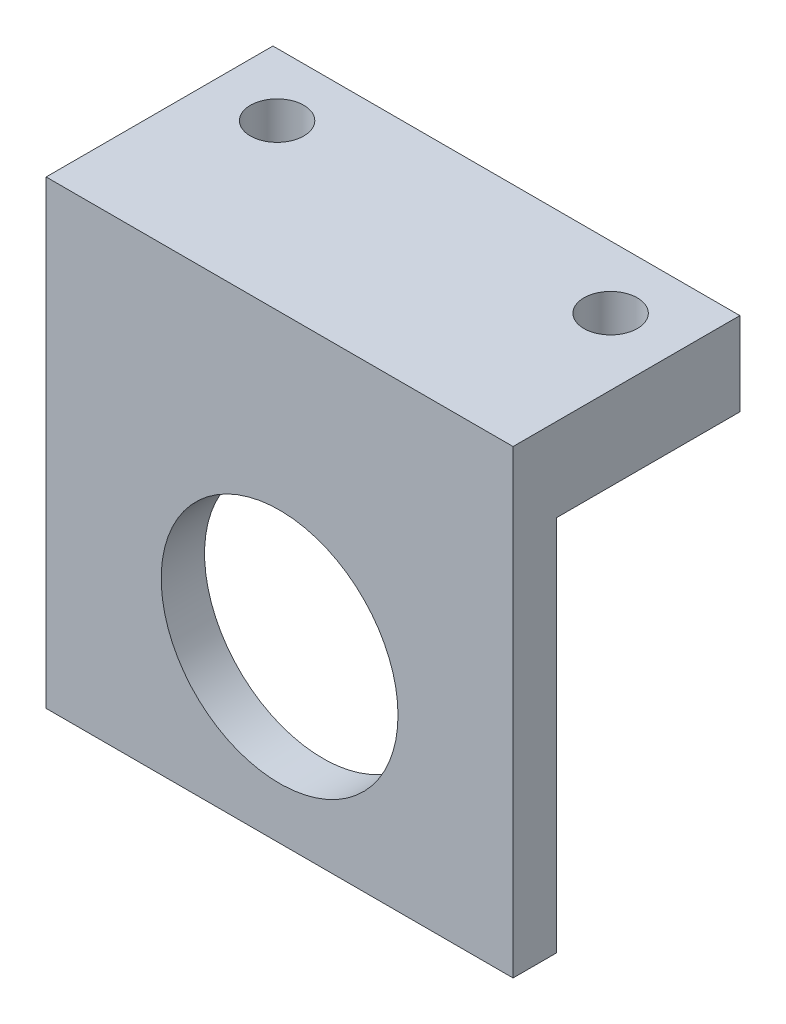
ISO-10303-21;
HEADER;
FILE_DESCRIPTION(('STEP AP214'),'2;1');
FILE_NAME('part.step','',(''),(''),'','','');
FILE_SCHEMA(('AUTOMOTIVE_DESIGN { 1 0 10303 214 1 1 1 1 }'));
ENDSEC;
DATA;
#1=APPLICATION_CONTEXT('core data for automotive mechanical design processes');
#2=APPLICATION_PROTOCOL_DEFINITION('international standard','automotive_design',2000,#1);
#3=PRODUCT_CONTEXT('',#1,'mechanical');
#4=PRODUCT('Part','Part','',(#3));
#5=PRODUCT_RELATED_PRODUCT_CATEGORY('part','',(#4));
#6=PRODUCT_DEFINITION_FORMATION('','',#4);
#7=PRODUCT_DEFINITION_CONTEXT('part definition',#1,'design');
#8=PRODUCT_DEFINITION('design','',#6,#7);
#9=PRODUCT_DEFINITION_SHAPE('','',#8);
#10=(LENGTH_UNIT() NAMED_UNIT(*) SI_UNIT(.MILLI.,.METRE.));
#11=(NAMED_UNIT(*) PLANE_ANGLE_UNIT() SI_UNIT($,.RADIAN.));
#12=(NAMED_UNIT(*) SI_UNIT($,.STERADIAN.) SOLID_ANGLE_UNIT());
#13=UNCERTAINTY_MEASURE_WITH_UNIT(LENGTH_MEASURE(1.E-05),#10,'distance_accuracy_value','');
#14=(GEOMETRIC_REPRESENTATION_CONTEXT(3) GLOBAL_UNCERTAINTY_ASSIGNED_CONTEXT((#13)) GLOBAL_UNIT_ASSIGNED_CONTEXT((#10,
#11,#12)) REPRESENTATION_CONTEXT('',''));
#15=CARTESIAN_POINT('',(0.,0.,0.));
#16=DIRECTION('',(0.,0.,1.));
#17=DIRECTION('',(1.,0.,0.));
#18=AXIS2_PLACEMENT_3D('',#15,#16,#17);
#19=CARTESIAN_POINT('',(0.,0.,0.));
#20=DIRECTION('',(0.,-1.,0.));
#21=DIRECTION('',(0.,0.,-1.));
#22=AXIS2_PLACEMENT_3D('',#19,#20,#21);
#23=PLANE('',#22);
#24=DIRECTION('',(1.,0.,0.));
#25=VECTOR('',#24,1.);
#26=CARTESIAN_POINT('',(35.56,0.,-18.415));
#27=LINE('',#26,#25);
#28=CARTESIAN_POINT('',(0.,0.,-18.415));
#29=VERTEX_POINT('',#28);
#30=CARTESIAN_POINT('',(35.56,0.,-18.415));
#31=VERTEX_POINT('',#30);
#32=EDGE_CURVE('E58',#29,#31,#27,.T.);
#33=ORIENTED_EDGE('',*,*,#32,.F.);
#34=DIRECTION('',(0.,0.,1.));
#35=VECTOR('',#34,1.);
#36=CARTESIAN_POINT('',(0.,0.,0.));
#37=LINE('',#36,#35);
#38=CARTESIAN_POINT('',(0.,0.,-32.385));
#39=VERTEX_POINT('',#38);
#40=EDGE_CURVE('E126',#39,#29,#37,.T.);
#41=ORIENTED_EDGE('',*,*,#40,.F.);
#42=DIRECTION('',(-1.,0.,0.));
#43=VECTOR('',#42,1.);
#44=CARTESIAN_POINT('',(0.,0.,-32.385));
#45=LINE('',#44,#43);
#46=CARTESIAN_POINT('',(35.56,0.,-32.385));
#47=VERTEX_POINT('',#46);
#48=EDGE_CURVE('E117',#47,#39,#45,.T.);
#49=ORIENTED_EDGE('',*,*,#48,.F.);
#50=DIRECTION('',(0.,0.,-1.));
#51=VECTOR('',#50,1.);
#52=CARTESIAN_POINT('',(35.56,0.,0.));
#53=LINE('',#52,#51);
#54=EDGE_CURVE('E54',#31,#47,#53,.T.);
#55=ORIENTED_EDGE('',*,*,#54,.F.);
#56=EDGE_LOOP('',(#33,#41,#49,#55));
#57=FACE_BOUND('',#56,.T.);
#58=CARTESIAN_POINT('',(5.08,0.,-27.6225));
#59=DIRECTION('',(0.,1.,0.));
#60=DIRECTION('',(0.,0.,1.));
#61=AXIS2_PLACEMENT_3D('',#58,#59,#60);
#62=CIRCLE('',#61,2.032);
#63=CARTESIAN_POINT('',(5.08,0.,-25.5905));
#64=VERTEX_POINT('',#63);
#65=EDGE_CURVE('E122',#64,#64,#62,.T.);
#66=ORIENTED_EDGE('',*,*,#65,.T.);
#67=EDGE_LOOP('',(#66));
#68=FACE_BOUND('',#67,.T.);
#69=CARTESIAN_POINT('',(30.48,0.,-27.6225));
#70=DIRECTION('',(0.,1.,0.));
#71=DIRECTION('',(0.,0.,1.));
#72=AXIS2_PLACEMENT_3D('',#69,#70,#71);
#73=CIRCLE('',#72,2.03200000000002);
#74=CARTESIAN_POINT('',(30.48,0.,-25.5905));
#75=VERTEX_POINT('',#74);
#76=EDGE_CURVE('E151',#75,#75,#73,.T.);
#77=ORIENTED_EDGE('',*,*,#76,.T.);
#78=EDGE_LOOP('',(#77));
#79=FACE_BOUND('',#78,.T.);
#80=ADVANCED_FACE('F39',(#57,#68,#79),#23,.T.);
#81=CARTESIAN_POINT('',(0.,6.35,0.));
#82=DIRECTION('',(0.,-1.,0.));
#83=DIRECTION('',(0.,0.,-1.));
#84=AXIS2_PLACEMENT_3D('',#81,#82,#83);
#85=PLANE('',#84);
#86=DIRECTION('',(0.,0.,1.));
#87=VECTOR('',#86,1.);
#88=CARTESIAN_POINT('',(0.,6.35,0.));
#89=LINE('',#88,#87);
#90=CARTESIAN_POINT('',(0.,6.35,-32.385));
#91=VERTEX_POINT('',#90);
#92=CARTESIAN_POINT('',(0.,6.35,-15.113));
#93=VERTEX_POINT('',#92);
#94=EDGE_CURVE('E96',#91,#93,#89,.T.);
#95=ORIENTED_EDGE('',*,*,#94,.T.);
#96=DIRECTION('',(1.,0.,0.));
#97=VECTOR('',#96,1.);
#98=CARTESIAN_POINT('',(35.56,6.35,-15.113));
#99=LINE('',#98,#97);
#100=CARTESIAN_POINT('',(35.56,6.35,-15.113));
#101=VERTEX_POINT('',#100);
#102=EDGE_CURVE('E104',#93,#101,#99,.T.);
#103=ORIENTED_EDGE('',*,*,#102,.T.);
#104=DIRECTION('',(0.,0.,-1.));
#105=VECTOR('',#104,1.);
#106=CARTESIAN_POINT('',(35.56,6.35,0.));
#107=LINE('',#106,#105);
#108=CARTESIAN_POINT('',(35.56,6.35,-32.385));
#109=VERTEX_POINT('',#108);
#110=EDGE_CURVE('E116',#101,#109,#107,.T.);
#111=ORIENTED_EDGE('',*,*,#110,.T.);
#112=DIRECTION('',(-1.,0.,0.));
#113=VECTOR('',#112,1.);
#114=CARTESIAN_POINT('',(0.,6.35,-32.385));
#115=LINE('',#114,#113);
#116=EDGE_CURVE('E114',#109,#91,#115,.T.);
#117=ORIENTED_EDGE('',*,*,#116,.T.);
#118=EDGE_LOOP('',(#95,#103,#111,#117));
#119=FACE_BOUND('',#118,.T.);
#120=CARTESIAN_POINT('',(5.08,6.35,-27.6225));
#121=DIRECTION('',(0.,1.,0.));
#122=DIRECTION('',(0.,0.,1.));
#123=AXIS2_PLACEMENT_3D('',#120,#121,#122);
#124=CIRCLE('',#123,2.032);
#125=CARTESIAN_POINT('',(5.08,6.35,-25.5905));
#126=VERTEX_POINT('',#125);
#127=EDGE_CURVE('E128',#126,#126,#124,.T.);
#128=ORIENTED_EDGE('',*,*,#127,.F.);
#129=EDGE_LOOP('',(#128));
#130=FACE_BOUND('',#129,.T.);
#131=CARTESIAN_POINT('',(30.48,6.35,-27.6225));
#132=DIRECTION('',(0.,1.,0.));
#133=DIRECTION('',(0.,0.,1.));
#134=AXIS2_PLACEMENT_3D('',#131,#132,#133);
#135=CIRCLE('',#134,2.03200000000002);
#136=CARTESIAN_POINT('',(30.48,6.35,-25.5905));
#137=VERTEX_POINT('',#136);
#138=EDGE_CURVE('E152',#137,#137,#135,.T.);
#139=ORIENTED_EDGE('',*,*,#138,.F.);
#140=EDGE_LOOP('',(#139));
#141=FACE_BOUND('',#140,.T.);
#142=ADVANCED_FACE('F111',(#119,#130,#141),#85,.F.);
#143=CARTESIAN_POINT('',(0.,6.35,0.));
#144=DIRECTION('',(1.,0.,0.));
#145=DIRECTION('',(0.,0.,-1.));
#146=AXIS2_PLACEMENT_3D('',#143,#144,#145);
#147=PLANE('',#146);
#148=DIRECTION('',(0.,1.,0.));
#149=VECTOR('',#148,1.);
#150=CARTESIAN_POINT('',(0.,-28.702,-15.113));
#151=LINE('',#150,#149);
#152=CARTESIAN_POINT('',(0.,-28.702,-15.113));
#153=VERTEX_POINT('',#152);
#154=EDGE_CURVE('E92',#153,#93,#151,.T.);
#155=ORIENTED_EDGE('',*,*,#154,.T.);
#156=ORIENTED_EDGE('',*,*,#94,.F.);
#157=DIRECTION('',(0.,-1.,0.));
#158=VECTOR('',#157,1.);
#159=CARTESIAN_POINT('',(0.,6.35,-32.385));
#160=LINE('',#159,#158);
#161=EDGE_CURVE('E47',#91,#39,#160,.T.);
#162=ORIENTED_EDGE('',*,*,#161,.T.);
#163=ORIENTED_EDGE('',*,*,#40,.T.);
#164=DIRECTION('',(0.,1.,0.));
#165=VECTOR('',#164,1.);
#166=CARTESIAN_POINT('',(0.,-28.702,-18.415));
#167=LINE('',#166,#165);
#168=CARTESIAN_POINT('',(0.,-28.702,-18.415));
#169=VERTEX_POINT('',#168);
#170=EDGE_CURVE('E101',#169,#29,#167,.T.);
#171=ORIENTED_EDGE('',*,*,#170,.F.);
#172=DIRECTION('',(0.,0.,-1.));
#173=VECTOR('',#172,1.);
#174=CARTESIAN_POINT('',(0.,-28.702,-18.415));
#175=LINE('',#174,#173);
#176=EDGE_CURVE('E98',#153,#169,#175,.T.);
#177=ORIENTED_EDGE('',*,*,#176,.F.);
#178=EDGE_LOOP('',(#155,#156,#162,#163,#171,#177));
#179=FACE_BOUND('',#178,.T.);
#180=ADVANCED_FACE('F41',(#179),#147,.F.);
#181=CARTESIAN_POINT('',(35.56,6.35,0.));
#182=DIRECTION('',(-1.,0.,0.));
#183=DIRECTION('',(0.,0.,1.));
#184=AXIS2_PLACEMENT_3D('',#181,#182,#183);
#185=PLANE('',#184);
#186=ORIENTED_EDGE('',*,*,#110,.F.);
#187=DIRECTION('',(0.,1.,0.));
#188=VECTOR('',#187,1.);
#189=CARTESIAN_POINT('',(35.56,-28.702,-15.113));
#190=LINE('',#189,#188);
#191=CARTESIAN_POINT('',(35.56,-28.702,-15.113));
#192=VERTEX_POINT('',#191);
#193=EDGE_CURVE('E100',#192,#101,#190,.T.);
#194=ORIENTED_EDGE('',*,*,#193,.F.);
#195=DIRECTION('',(0.,0.,1.));
#196=VECTOR('',#195,1.);
#197=CARTESIAN_POINT('',(35.56,-28.702,-18.415));
#198=LINE('',#197,#196);
#199=CARTESIAN_POINT('',(35.56,-28.702,-18.415));
#200=VERTEX_POINT('',#199);
#201=EDGE_CURVE('E141',#200,#192,#198,.T.);
#202=ORIENTED_EDGE('',*,*,#201,.F.);
#203=DIRECTION('',(0.,1.,0.));
#204=VECTOR('',#203,1.);
#205=CARTESIAN_POINT('',(35.56,-28.702,-18.415));
#206=LINE('',#205,#204);
#207=EDGE_CURVE('E139',#200,#31,#206,.T.);
#208=ORIENTED_EDGE('',*,*,#207,.T.);
#209=ORIENTED_EDGE('',*,*,#54,.T.);
#210=DIRECTION('',(0.,-1.,0.));
#211=VECTOR('',#210,1.);
#212=CARTESIAN_POINT('',(35.56,6.35,-32.385));
#213=LINE('',#212,#211);
#214=EDGE_CURVE('E11',#109,#47,#213,.T.);
#215=ORIENTED_EDGE('',*,*,#214,.F.);
#216=EDGE_LOOP('',(#186,#194,#202,#208,#209,#215));
#217=FACE_BOUND('',#216,.T.);
#218=ADVANCED_FACE('F135',(#217),#185,.F.);
#219=CARTESIAN_POINT('',(0.,6.35,-32.385));
#220=DIRECTION('',(0.,0.,1.));
#221=DIRECTION('',(1.,0.,0.));
#222=AXIS2_PLACEMENT_3D('',#219,#220,#221);
#223=PLANE('',#222);
#224=ORIENTED_EDGE('',*,*,#48,.T.);
#225=ORIENTED_EDGE('',*,*,#161,.F.);
#226=ORIENTED_EDGE('',*,*,#116,.F.);
#227=ORIENTED_EDGE('',*,*,#214,.T.);
#228=EDGE_LOOP('',(#224,#225,#226,#227));
#229=FACE_BOUND('',#228,.T.);
#230=ADVANCED_FACE('F132',(#229),#223,.F.);
#231=CARTESIAN_POINT('',(5.08,6.35,-27.6225));
#232=DIRECTION('',(0.,-1.,0.));
#233=DIRECTION('',(0.,0.,-1.));
#234=AXIS2_PLACEMENT_3D('',#231,#232,#233);
#235=CYLINDRICAL_SURFACE('',#234,2.032);
#236=ORIENTED_EDGE('',*,*,#127,.T.);
#237=EDGE_LOOP('',(#236));
#238=FACE_BOUND('',#237,.T.);
#239=ORIENTED_EDGE('',*,*,#65,.F.);
#240=EDGE_LOOP('',(#239));
#241=FACE_BOUND('',#240,.T.);
#242=ADVANCED_FACE('F163',(#238,#241),#235,.F.);
#243=CARTESIAN_POINT('',(30.48,6.35,-27.6225));
#244=DIRECTION('',(0.,-1.,0.));
#245=DIRECTION('',(0.,0.,-1.));
#246=AXIS2_PLACEMENT_3D('',#243,#244,#245);
#247=CYLINDRICAL_SURFACE('',#246,2.03200000000002);
#248=ORIENTED_EDGE('',*,*,#138,.T.);
#249=EDGE_LOOP('',(#248));
#250=FACE_BOUND('',#249,.T.);
#251=ORIENTED_EDGE('',*,*,#76,.F.);
#252=EDGE_LOOP('',(#251));
#253=FACE_BOUND('',#252,.T.);
#254=ADVANCED_FACE('F165',(#250,#253),#247,.F.);
#255=CARTESIAN_POINT('',(35.56,-28.702,-15.113));
#256=DIRECTION('',(0.,0.,-1.));
#257=DIRECTION('',(-1.,0.,0.));
#258=AXIS2_PLACEMENT_3D('',#255,#256,#257);
#259=PLANE('',#258);
#260=CARTESIAN_POINT('',(17.78,-15.748,-15.113));
#261=DIRECTION('',(0.,0.,1.));
#262=DIRECTION('',(1.,0.,0.));
#263=AXIS2_PLACEMENT_3D('',#260,#261,#262);
#264=CIRCLE('',#263,9.01700000000001);
#265=CARTESIAN_POINT('',(26.797,-15.748,-15.113));
#266=VERTEX_POINT('',#265);
#267=EDGE_CURVE('E109',#266,#266,#264,.T.);
#268=ORIENTED_EDGE('',*,*,#267,.F.);
#269=EDGE_LOOP('',(#268));
#270=FACE_BOUND('',#269,.T.);
#271=ORIENTED_EDGE('',*,*,#193,.T.);
#272=ORIENTED_EDGE('',*,*,#102,.F.);
#273=ORIENTED_EDGE('',*,*,#154,.F.);
#274=DIRECTION('',(-1.,0.,0.));
#275=VECTOR('',#274,1.);
#276=CARTESIAN_POINT('',(35.56,-28.702,-15.113));
#277=LINE('',#276,#275);
#278=EDGE_CURVE('E276',#192,#153,#277,.T.);
#279=ORIENTED_EDGE('',*,*,#278,.F.);
#280=EDGE_LOOP('',(#271,#272,#273,#279));
#281=FACE_BOUND('',#280,.T.);
#282=ADVANCED_FACE('F105',(#270,#281),#259,.F.);
#283=CARTESIAN_POINT('',(35.56,-28.702,-18.415));
#284=DIRECTION('',(0.,0.,1.));
#285=DIRECTION('',(1.,0.,0.));
#286=AXIS2_PLACEMENT_3D('',#283,#284,#285);
#287=PLANE('',#286);
#288=CARTESIAN_POINT('',(17.78,-15.748,-18.415));
#289=DIRECTION('',(0.,0.,1.));
#290=DIRECTION('',(1.,0.,0.));
#291=AXIS2_PLACEMENT_3D('',#288,#289,#290);
#292=CIRCLE('',#291,9.01700000000001);
#293=CARTESIAN_POINT('',(26.797,-15.748,-18.415));
#294=VERTEX_POINT('',#293);
#295=EDGE_CURVE('E270',#294,#294,#292,.F.);
#296=ORIENTED_EDGE('',*,*,#295,.F.);
#297=EDGE_LOOP('',(#296));
#298=FACE_BOUND('',#297,.T.);
#299=ORIENTED_EDGE('',*,*,#32,.T.);
#300=ORIENTED_EDGE('',*,*,#207,.F.);
#301=DIRECTION('',(1.,0.,0.));
#302=VECTOR('',#301,1.);
#303=CARTESIAN_POINT('',(35.56,-28.702,-18.415));
#304=LINE('',#303,#302);
#305=EDGE_CURVE('E144',#169,#200,#304,.T.);
#306=ORIENTED_EDGE('',*,*,#305,.F.);
#307=ORIENTED_EDGE('',*,*,#170,.T.);
#308=EDGE_LOOP('',(#299,#300,#306,#307));
#309=FACE_BOUND('',#308,.T.);
#310=ADVANCED_FACE('F210',(#298,#309),#287,.F.);
#311=CARTESIAN_POINT('',(0.,-28.702,0.));
#312=DIRECTION('',(0.,-1.,0.));
#313=DIRECTION('',(0.,0.,-1.));
#314=AXIS2_PLACEMENT_3D('',#311,#312,#313);
#315=PLANE('',#314);
#316=ORIENTED_EDGE('',*,*,#201,.T.);
#317=ORIENTED_EDGE('',*,*,#278,.T.);
#318=ORIENTED_EDGE('',*,*,#176,.T.);
#319=ORIENTED_EDGE('',*,*,#305,.T.);
#320=EDGE_LOOP('',(#316,#317,#318,#319));
#321=FACE_BOUND('',#320,.T.);
#322=ADVANCED_FACE('F202',(#321),#315,.T.);
#323=CARTESIAN_POINT('',(17.78,-15.748,-32.386));
#324=DIRECTION('',(0.,0.,1.));
#325=DIRECTION('',(1.,0.,0.));
#326=AXIS2_PLACEMENT_3D('',#323,#324,#325);
#327=CYLINDRICAL_SURFACE('',#326,9.01700000000001);
#328=ORIENTED_EDGE('',*,*,#267,.T.);
#329=EDGE_LOOP('',(#328));
#330=FACE_BOUND('',#329,.T.);
#331=ORIENTED_EDGE('',*,*,#295,.T.);
#332=EDGE_LOOP('',(#331));
#333=FACE_BOUND('',#332,.T.);
#334=ADVANCED_FACE('F198',(#330,#333),#327,.F.);
#335=CLOSED_SHELL('',(#80,#142,#180,#218,#230,#242,#254,#282,#310,#322,#334));
#336=MANIFOLD_SOLID_BREP('B2',#335);
#337=ADVANCED_BREP_SHAPE_REPRESENTATION('',(#18,#336),#14);
#338=SHAPE_DEFINITION_REPRESENTATION(#9,#337);
ENDSEC;
END-ISO-10303-21;
